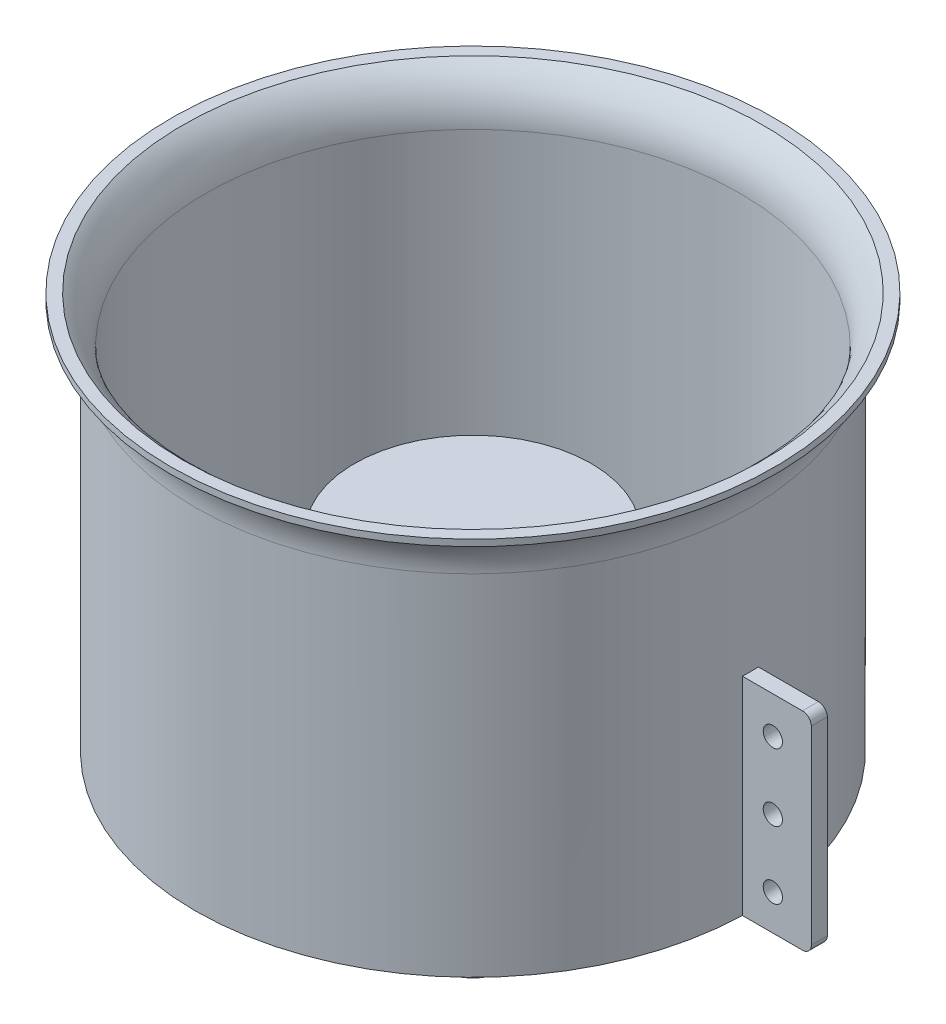
ISO-10303-21;
HEADER;
FILE_DESCRIPTION(('STEP AP214'),'2;1');
FILE_NAME('part.step','',(''),(''),'','','');
FILE_SCHEMA(('AUTOMOTIVE_DESIGN { 1 0 10303 214 1 1 1 1 }'));
ENDSEC;
DATA;
#1=APPLICATION_CONTEXT('core data for automotive mechanical design processes');
#2=APPLICATION_PROTOCOL_DEFINITION('international standard','automotive_design',2000,#1);
#3=PRODUCT_CONTEXT('',#1,'mechanical');
#4=PRODUCT('Part','Part','',(#3));
#5=PRODUCT_RELATED_PRODUCT_CATEGORY('part','',(#4));
#6=PRODUCT_DEFINITION_FORMATION('','',#4);
#7=PRODUCT_DEFINITION_CONTEXT('part definition',#1,'design');
#8=PRODUCT_DEFINITION('design','',#6,#7);
#9=PRODUCT_DEFINITION_SHAPE('','',#8);
#10=(LENGTH_UNIT() NAMED_UNIT(*) SI_UNIT(.MILLI.,.METRE.));
#11=(NAMED_UNIT(*) PLANE_ANGLE_UNIT() SI_UNIT($,.RADIAN.));
#12=(NAMED_UNIT(*) SI_UNIT($,.STERADIAN.) SOLID_ANGLE_UNIT());
#13=UNCERTAINTY_MEASURE_WITH_UNIT(LENGTH_MEASURE(1.E-05),#10,'distance_accuracy_value','');
#14=(GEOMETRIC_REPRESENTATION_CONTEXT(3) GLOBAL_UNCERTAINTY_ASSIGNED_CONTEXT((#13)) GLOBAL_UNIT_ASSIGNED_CONTEXT((#10,
#11,#12)) REPRESENTATION_CONTEXT('',''));
#15=CARTESIAN_POINT('',(0.,0.,0.));
#16=DIRECTION('',(0.,0.,1.));
#17=DIRECTION('',(1.,0.,0.));
#18=AXIS2_PLACEMENT_3D('',#15,#16,#17);
#19=CARTESIAN_POINT('',(0.,-20.,0.));
#20=DIRECTION('',(0.,-1.,0.));
#21=DIRECTION('',(0.,0.,-1.));
#22=AXIS2_PLACEMENT_3D('',#19,#20,#21);
#23=PLANE('',#22);
#24=CARTESIAN_POINT('',(0.,-20.,0.));
#25=DIRECTION('',(0.,-1.,0.));
#26=DIRECTION('',(0.,0.,-1.));
#27=AXIS2_PLACEMENT_3D('',#24,#25,#26);
#28=CIRCLE('',#27,17.5);
#29=CARTESIAN_POINT('',(0.,-20.,-17.5));
#30=VERTEX_POINT('',#29);
#31=EDGE_CURVE('E51',#30,#30,#28,.T.);
#32=ORIENTED_EDGE('',*,*,#31,.T.);
#33=EDGE_LOOP('',(#32));
#34=FACE_BOUND('',#33,.T.);
#35=CARTESIAN_POINT('',(0.,-20.,0.));
#36=DIRECTION('',(0.,-1.,0.));
#37=DIRECTION('',(0.,0.,-1.));
#38=AXIS2_PLACEMENT_3D('',#35,#36,#37);
#39=CIRCLE('',#38,6.);
#40=CARTESIAN_POINT('',(0.,-20.,-6.));
#41=VERTEX_POINT('',#40);
#42=EDGE_CURVE('E59',#41,#41,#39,.T.);
#43=ORIENTED_EDGE('',*,*,#42,.F.);
#44=EDGE_LOOP('',(#43));
#45=FACE_BOUND('',#44,.T.);
#46=ADVANCED_FACE('F40',(#34,#45),#23,.T.);
#47=CARTESIAN_POINT('',(0.,0.,0.));
#48=DIRECTION('',(0.,-1.,0.));
#49=DIRECTION('',(0.,0.,-1.));
#50=AXIS2_PLACEMENT_3D('',#47,#48,#49);
#51=PLANE('',#50);
#52=CARTESIAN_POINT('',(0.,0.,0.));
#53=DIRECTION('',(0.,-1.,0.));
#54=DIRECTION('',(0.,0.,-1.));
#55=AXIS2_PLACEMENT_3D('',#52,#53,#54);
#56=CIRCLE('',#55,20.);
#57=CARTESIAN_POINT('',(0.,0.,-20.));
#58=VERTEX_POINT('',#57);
#59=EDGE_CURVE('E44',#58,#58,#56,.T.);
#60=ORIENTED_EDGE('',*,*,#59,.T.);
#61=EDGE_LOOP('',(#60));
#62=FACE_BOUND('',#61,.T.);
#63=CARTESIAN_POINT('',(0.,0.,0.));
#64=DIRECTION('',(0.,-1.,0.));
#65=DIRECTION('',(0.,0.,-1.));
#66=AXIS2_PLACEMENT_3D('',#63,#64,#65);
#67=CIRCLE('',#66,17.5);
#68=CARTESIAN_POINT('',(0.,0.,-17.5));
#69=VERTEX_POINT('',#68);
#70=EDGE_CURVE('E53',#69,#69,#67,.T.);
#71=ORIENTED_EDGE('',*,*,#70,.F.);
#72=EDGE_LOOP('',(#71));
#73=FACE_BOUND('',#72,.T.);
#74=ADVANCED_FACE('F75',(#62,#73),#51,.T.);
#75=CARTESIAN_POINT('',(0.,32.,0.));
#76=DIRECTION('',(0.,-1.,0.));
#77=DIRECTION('',(0.,0.,-1.));
#78=AXIS2_PLACEMENT_3D('',#75,#76,#77);
#79=CYLINDRICAL_SURFACE('',#78,20.);
#80=CARTESIAN_POINT('',(0.,32.,0.));
#81=DIRECTION('',(0.,-1.,0.));
#82=DIRECTION('',(0.,0.,-1.));
#83=AXIS2_PLACEMENT_3D('',#80,#81,#82);
#84=CIRCLE('',#83,20.);
#85=CARTESIAN_POINT('',(0.,32.,-20.));
#86=VERTEX_POINT('',#85);
#87=EDGE_CURVE('E11',#86,#86,#84,.T.);
#88=ORIENTED_EDGE('',*,*,#87,.T.);
#89=EDGE_LOOP('',(#88));
#90=FACE_BOUND('',#89,.T.);
#91=ORIENTED_EDGE('',*,*,#59,.F.);
#92=EDGE_LOOP('',(#91));
#93=FACE_BOUND('',#92,.T.);
#94=ADVANCED_FACE('F42',(#90,#93),#79,.T.);
#95=CARTESIAN_POINT('',(0.,32.,0.));
#96=DIRECTION('',(0.,-1.,0.));
#97=DIRECTION('',(0.,0.,-1.));
#98=AXIS2_PLACEMENT_3D('',#95,#96,#97);
#99=PLANE('',#98);
#100=ORIENTED_EDGE('',*,*,#87,.F.);
#101=EDGE_LOOP('',(#100));
#102=FACE_BOUND('',#101,.T.);
#103=ADVANCED_FACE('F86',(#102),#99,.F.);
#104=CARTESIAN_POINT('',(0.,-20.,0.));
#105=DIRECTION('',(0.,1.,0.));
#106=DIRECTION('',(0.,0.,1.));
#107=AXIS2_PLACEMENT_3D('',#104,#105,#106);
#108=CYLINDRICAL_SURFACE('',#107,17.5);
#109=ORIENTED_EDGE('',*,*,#31,.F.);
#110=EDGE_LOOP('',(#109));
#111=FACE_BOUND('',#110,.T.);
#112=ORIENTED_EDGE('',*,*,#70,.T.);
#113=EDGE_LOOP('',(#112));
#114=FACE_BOUND('',#113,.T.);
#115=ADVANCED_FACE('F70',(#111,#114),#108,.T.);
#116=CARTESIAN_POINT('',(0.,-29.,0.));
#117=DIRECTION('',(0.,1.,0.));
#118=DIRECTION('',(0.,0.,1.));
#119=AXIS2_PLACEMENT_3D('',#116,#117,#118);
#120=CYLINDRICAL_SURFACE('',#119,6.);
#121=CARTESIAN_POINT('',(0.,-29.,0.));
#122=DIRECTION('',(0.,-1.,0.));
#123=DIRECTION('',(0.,0.,-1.));
#124=AXIS2_PLACEMENT_3D('',#121,#122,#123);
#125=CIRCLE('',#124,6.);
#126=CARTESIAN_POINT('',(0.,-29.,-6.));
#127=VERTEX_POINT('',#126);
#128=EDGE_CURVE('E56',#127,#127,#125,.T.);
#129=ORIENTED_EDGE('',*,*,#128,.F.);
#130=EDGE_LOOP('',(#129));
#131=FACE_BOUND('',#130,.T.);
#132=ORIENTED_EDGE('',*,*,#42,.T.);
#133=EDGE_LOOP('',(#132));
#134=FACE_BOUND('',#133,.T.);
#135=ADVANCED_FACE('F67',(#131,#134),#120,.T.);
#136=CARTESIAN_POINT('',(0.,-29.,0.));
#137=DIRECTION('',(0.,-1.,0.));
#138=DIRECTION('',(0.,0.,-1.));
#139=AXIS2_PLACEMENT_3D('',#136,#137,#138);
#140=PLANE('',#139);
#141=ORIENTED_EDGE('',*,*,#128,.T.);
#142=EDGE_LOOP('',(#141));
#143=FACE_BOUND('',#142,.T.);
#144=ADVANCED_FACE('F65',(#143),#140,.T.);
#145=CLOSED_SHELL('',(#46,#74,#94,#103,#115,#135,#144));
#146=MANIFOLD_SOLID_BREP('B2',#145);
#147=CARTESIAN_POINT('',(-46.875,0.,0.));
#148=DIRECTION('',(0.,-1.,0.));
#149=DIRECTION('',(0.,0.,-1.));
#150=AXIS2_PLACEMENT_3D('',#147,#148,#149);
#151=PLANE('',#150);
#152=CARTESIAN_POINT('',(0.,0.,0.));
#153=DIRECTION('',(0.,1.,0.));
#154=DIRECTION('',(0.,0.,1.));
#155=AXIS2_PLACEMENT_3D('',#152,#153,#154);
#156=CIRCLE('',#155,45.075);
#157=CARTESIAN_POINT('',(0.,0.,45.075));
#158=VERTEX_POINT('',#157);
#159=EDGE_CURVE('E346',#158,#158,#156,.T.);
#160=ORIENTED_EDGE('',*,*,#159,.T.);
#161=EDGE_LOOP('',(#160));
#162=FACE_BOUND('',#161,.T.);
#163=DIRECTION('',(-1.,0.,0.));
#164=VECTOR('',#163,1.);
#165=CARTESIAN_POINT('',(45.075,0.,-1.35));
#166=LINE('',#165,#164);
#167=CARTESIAN_POINT('',(57.,0.,-1.35));
#168=VERTEX_POINT('',#167);
#169=CARTESIAN_POINT('',(46.855555967249,0.,-1.35));
#170=VERTEX_POINT('',#169);
#171=EDGE_CURVE('E233',#168,#170,#166,.T.);
#172=ORIENTED_EDGE('',*,*,#171,.F.);
#173=DIRECTION('',(0.,0.,-1.));
#174=VECTOR('',#173,1.);
#175=CARTESIAN_POINT('',(57.,0.,0.));
#176=LINE('',#175,#174);
#177=CARTESIAN_POINT('',(57.,0.,1.35));
#178=VERTEX_POINT('',#177);
#179=EDGE_CURVE('E38',#168,#178,#176,.F.);
#180=ORIENTED_EDGE('',*,*,#179,.T.);
#181=DIRECTION('',(-1.,0.,0.));
#182=VECTOR('',#181,1.);
#183=CARTESIAN_POINT('',(45.075,0.,1.35));
#184=LINE('',#183,#182);
#185=CARTESIAN_POINT('',(46.855555967249,0.,1.35));
#186=VERTEX_POINT('',#185);
#187=EDGE_CURVE('E288',#178,#186,#184,.T.);
#188=ORIENTED_EDGE('',*,*,#187,.T.);
#189=CARTESIAN_POINT('',(0.,0.,0.));
#190=DIRECTION('',(0.,1.,0.));
#191=DIRECTION('',(0.,0.,1.));
#192=AXIS2_PLACEMENT_3D('',#189,#190,#191);
#193=CIRCLE('',#192,46.875);
#194=CARTESIAN_POINT('',(-46.855555967249,0.,1.35));
#195=VERTEX_POINT('',#194);
#196=EDGE_CURVE('E326',#195,#186,#193,.T.);
#197=ORIENTED_EDGE('',*,*,#196,.F.);
#198=DIRECTION('',(1.,0.,0.));
#199=VECTOR('',#198,1.);
#200=CARTESIAN_POINT('',(-45.075,0.,1.35));
#201=LINE('',#200,#199);
#202=CARTESIAN_POINT('',(-57.,0.,1.35));
#203=VERTEX_POINT('',#202);
#204=EDGE_CURVE('E314',#203,#195,#201,.T.);
#205=ORIENTED_EDGE('',*,*,#204,.F.);
#206=DIRECTION('',(0.,0.,1.));
#207=VECTOR('',#206,1.);
#208=CARTESIAN_POINT('',(-57.,0.,0.));
#209=LINE('',#208,#207);
#210=CARTESIAN_POINT('',(-57.,0.,-1.35));
#211=VERTEX_POINT('',#210);
#212=EDGE_CURVE('E238',#203,#211,#209,.F.);
#213=ORIENTED_EDGE('',*,*,#212,.T.);
#214=DIRECTION('',(1.,0.,0.));
#215=VECTOR('',#214,1.);
#216=CARTESIAN_POINT('',(-45.075,0.,-1.35));
#217=LINE('',#216,#215);
#218=CARTESIAN_POINT('',(-46.855555967249,0.,-1.35));
#219=VERTEX_POINT('',#218);
#220=EDGE_CURVE('E322',#211,#219,#217,.T.);
#221=ORIENTED_EDGE('',*,*,#220,.T.);
#222=EDGE_CURVE('E325',#170,#219,#193,.T.);
#223=ORIENTED_EDGE('',*,*,#222,.F.);
#224=EDGE_LOOP('',(#172,#180,#188,#197,#205,#213,#221,#223));
#225=FACE_BOUND('',#224,.T.);
#226=ADVANCED_FACE('F140',(#162,#225),#151,.T.);
#227=CARTESIAN_POINT('',(0.,55.,0.));
#228=DIRECTION('',(0.,1.,0.));
#229=DIRECTION('',(0.,0.,1.));
#230=AXIS2_PLACEMENT_3D('',#227,#228,#229);
#231=CYLINDRICAL_SURFACE('',#230,45.075);
#232=CARTESIAN_POINT('',(0.,59.,0.));
#233=DIRECTION('',(0.,1.,0.));
#234=DIRECTION('',(0.,0.,1.));
#235=AXIS2_PLACEMENT_3D('',#232,#233,#234);
#236=CIRCLE('',#235,45.075);
#237=CARTESIAN_POINT('',(0.,59.,45.075));
#238=VERTEX_POINT('',#237);
#239=EDGE_CURVE('E343',#238,#238,#236,.T.);
#240=ORIENTED_EDGE('',*,*,#239,.T.);
#241=EDGE_LOOP('',(#240));
#242=FACE_BOUND('',#241,.T.);
#243=ORIENTED_EDGE('',*,*,#159,.F.);
#244=EDGE_LOOP('',(#243));
#245=FACE_BOUND('',#244,.T.);
#246=ADVANCED_FACE('F406',(#242,#245),#231,.F.);
#247=CARTESIAN_POINT('',(0.,59.,0.));
#248=DIRECTION('',(0.,1.,0.));
#249=DIRECTION('',(0.,0.,1.));
#250=AXIS2_PLACEMENT_3D('',#247,#248,#249);
#251=TOROIDAL_SURFACE('',#250,55.1903662420382,10.1153662420382);
#252=CARTESIAN_POINT('',(0.,67.,0.));
#253=DIRECTION('',(0.,1.,0.));
#254=DIRECTION('',(0.,0.,1.));
#255=AXIS2_PLACEMENT_3D('',#252,#253,#254);
#256=CIRCLE('',#255,49.);
#257=CARTESIAN_POINT('',(0.,67.,49.));
#258=VERTEX_POINT('',#257);
#259=EDGE_CURVE('E340',#258,#258,#256,.T.);
#260=ORIENTED_EDGE('',*,*,#259,.T.);
#261=EDGE_LOOP('',(#260));
#262=FACE_BOUND('',#261,.T.);
#263=ORIENTED_EDGE('',*,*,#239,.F.);
#264=EDGE_LOOP('',(#263));
#265=FACE_BOUND('',#264,.T.);
#266=ADVANCED_FACE('F412',(#262,#265),#251,.T.);
#267=CARTESIAN_POINT('',(-49.,67.,0.));
#268=DIRECTION('',(0.,1.,0.));
#269=DIRECTION('',(0.,0.,1.));
#270=AXIS2_PLACEMENT_3D('',#267,#268,#269);
#271=PLANE('',#270);
#272=CARTESIAN_POINT('',(0.,67.,0.));
#273=DIRECTION('',(0.,1.,0.));
#274=DIRECTION('',(0.,0.,1.));
#275=AXIS2_PLACEMENT_3D('',#272,#273,#274);
#276=CIRCLE('',#275,51.);
#277=CARTESIAN_POINT('',(0.,67.,51.));
#278=VERTEX_POINT('',#277);
#279=EDGE_CURVE('E337',#278,#278,#276,.T.);
#280=ORIENTED_EDGE('',*,*,#279,.T.);
#281=EDGE_LOOP('',(#280));
#282=FACE_BOUND('',#281,.T.);
#283=ORIENTED_EDGE('',*,*,#259,.F.);
#284=EDGE_LOOP('',(#283));
#285=FACE_BOUND('',#284,.T.);
#286=ADVANCED_FACE('F466',(#282,#285),#271,.T.);
#287=CARTESIAN_POINT('',(0.,55.,0.));
#288=DIRECTION('',(0.,1.,0.));
#289=DIRECTION('',(0.,0.,1.));
#290=AXIS2_PLACEMENT_3D('',#287,#288,#289);
#291=CYLINDRICAL_SURFACE('',#290,51.);
#292=CARTESIAN_POINT('',(0.,65.9,0.));
#293=DIRECTION('',(0.,1.,0.));
#294=DIRECTION('',(0.,0.,1.));
#295=AXIS2_PLACEMENT_3D('',#292,#293,#294);
#296=CIRCLE('',#295,51.);
#297=CARTESIAN_POINT('',(0.,65.9,51.));
#298=VERTEX_POINT('',#297);
#299=EDGE_CURVE('E334',#298,#298,#296,.T.);
#300=ORIENTED_EDGE('',*,*,#299,.T.);
#301=EDGE_LOOP('',(#300));
#302=FACE_BOUND('',#301,.T.);
#303=ORIENTED_EDGE('',*,*,#279,.F.);
#304=EDGE_LOOP('',(#303));
#305=FACE_BOUND('',#304,.T.);
#306=ADVANCED_FACE('F462',(#302,#305),#291,.T.);
#307=CARTESIAN_POINT('',(-51.,65.9,0.));
#308=DIRECTION('',(0.,-1.,0.));
#309=DIRECTION('',(0.,0.,-1.));
#310=AXIS2_PLACEMENT_3D('',#307,#308,#309);
#311=PLANE('',#310);
#312=CARTESIAN_POINT('',(0.,65.9,0.));
#313=DIRECTION('',(0.,1.,0.));
#314=DIRECTION('',(0.,0.,1.));
#315=AXIS2_PLACEMENT_3D('',#312,#313,#314);
#316=CIRCLE('',#315,49.5);
#317=CARTESIAN_POINT('',(0.,65.9,49.5));
#318=VERTEX_POINT('',#317);
#319=EDGE_CURVE('E331',#318,#318,#316,.T.);
#320=ORIENTED_EDGE('',*,*,#319,.T.);
#321=EDGE_LOOP('',(#320));
#322=FACE_BOUND('',#321,.T.);
#323=ORIENTED_EDGE('',*,*,#299,.F.);
#324=EDGE_LOOP('',(#323));
#325=FACE_BOUND('',#324,.T.);
#326=ADVANCED_FACE('F458',(#322,#325),#311,.T.);
#327=CARTESIAN_POINT('',(0.,59.,0.));
#328=DIRECTION('',(0.,1.,0.));
#329=DIRECTION('',(0.,0.,1.));
#330=AXIS2_PLACEMENT_3D('',#327,#328,#329);
#331=TOROIDAL_SURFACE('',#330,57.2560714285714,10.3810714285714);
#332=CARTESIAN_POINT('',(0.,59.,0.));
#333=DIRECTION('',(0.,1.,0.));
#334=DIRECTION('',(0.,0.,1.));
#335=AXIS2_PLACEMENT_3D('',#332,#333,#334);
#336=CIRCLE('',#335,46.875);
#337=CARTESIAN_POINT('',(0.,59.,46.875));
#338=VERTEX_POINT('',#337);
#339=EDGE_CURVE('E328',#338,#338,#336,.T.);
#340=ORIENTED_EDGE('',*,*,#339,.T.);
#341=EDGE_LOOP('',(#340));
#342=FACE_BOUND('',#341,.T.);
#343=ORIENTED_EDGE('',*,*,#319,.F.);
#344=EDGE_LOOP('',(#343));
#345=FACE_BOUND('',#344,.T.);
#346=ADVANCED_FACE('F455',(#342,#345),#331,.F.);
#347=CARTESIAN_POINT('',(0.,55.,0.));
#348=DIRECTION('',(0.,1.,0.));
#349=DIRECTION('',(0.,0.,1.));
#350=AXIS2_PLACEMENT_3D('',#347,#348,#349);
#351=CYLINDRICAL_SURFACE('',#350,46.875);
#352=DIRECTION('',(0.,1.,0.));
#353=VECTOR('',#352,1.);
#354=CARTESIAN_POINT('',(46.855555967249,55.,1.35));
#355=LINE('',#354,#353);
#356=CARTESIAN_POINT('',(46.855555967249,35.,1.35));
#357=VERTEX_POINT('',#356);
#358=EDGE_CURVE('E255',#357,#186,#355,.F.);
#359=ORIENTED_EDGE('',*,*,#358,.F.);
#360=CARTESIAN_POINT('',(0.,35.,0.));
#361=DIRECTION('',(0.,1.,0.));
#362=DIRECTION('',(0.,0.,1.));
#363=AXIS2_PLACEMENT_3D('',#360,#361,#362);
#364=CIRCLE('',#363,46.875);
#365=CARTESIAN_POINT('',(46.855555967249,35.,-1.35));
#366=VERTEX_POINT('',#365);
#367=EDGE_CURVE('E237',#366,#357,#364,.F.);
#368=ORIENTED_EDGE('',*,*,#367,.F.);
#369=DIRECTION('',(0.,1.,0.));
#370=VECTOR('',#369,1.);
#371=CARTESIAN_POINT('',(46.855555967249,55.,-1.35));
#372=LINE('',#371,#370);
#373=EDGE_CURVE('E229',#366,#170,#372,.F.);
#374=ORIENTED_EDGE('',*,*,#373,.T.);
#375=ORIENTED_EDGE('',*,*,#222,.T.);
#376=DIRECTION('',(0.,1.,0.));
#377=VECTOR('',#376,1.);
#378=CARTESIAN_POINT('',(-46.855555967249,55.,-1.35));
#379=LINE('',#378,#377);
#380=CARTESIAN_POINT('',(-46.855555967249,35.,-1.35));
#381=VERTEX_POINT('',#380);
#382=EDGE_CURVE('E354',#381,#219,#379,.F.);
#383=ORIENTED_EDGE('',*,*,#382,.F.);
#384=CARTESIAN_POINT('',(0.,35.,0.));
#385=DIRECTION('',(0.,1.,0.));
#386=DIRECTION('',(0.,0.,1.));
#387=AXIS2_PLACEMENT_3D('',#384,#385,#386);
#388=CIRCLE('',#387,46.875);
#389=CARTESIAN_POINT('',(-46.855555967249,35.,1.35));
#390=VERTEX_POINT('',#389);
#391=EDGE_CURVE('E352',#390,#381,#388,.F.);
#392=ORIENTED_EDGE('',*,*,#391,.F.);
#393=DIRECTION('',(0.,1.,0.));
#394=VECTOR('',#393,1.);
#395=CARTESIAN_POINT('',(-46.855555967249,55.,1.35));
#396=LINE('',#395,#394);
#397=EDGE_CURVE('E349',#390,#195,#396,.F.);
#398=ORIENTED_EDGE('',*,*,#397,.T.);
#399=ORIENTED_EDGE('',*,*,#196,.T.);
#400=EDGE_LOOP('',(#359,#368,#374,#375,#383,#392,#398,#399));
#401=FACE_BOUND('',#400,.T.);
#402=ORIENTED_EDGE('',*,*,#339,.F.);
#403=EDGE_LOOP('',(#402));
#404=FACE_BOUND('',#403,.T.);
#405=ADVANCED_FACE('F251',(#401,#404),#351,.T.);
#406=CARTESIAN_POINT('',(-58.5,35.,-1.35));
#407=DIRECTION('',(-1.,0.,0.));
#408=DIRECTION('',(0.,-1.,0.));
#409=AXIS2_PLACEMENT_3D('',#406,#407,#408);
#410=PLANE('',#409);
#411=DIRECTION('',(0.,-1.,0.));
#412=VECTOR('',#411,1.);
#413=CARTESIAN_POINT('',(-58.5,35.,1.35));
#414=LINE('',#413,#412);
#415=CARTESIAN_POINT('',(-58.5,33.5,1.35));
#416=VERTEX_POINT('',#415);
#417=CARTESIAN_POINT('',(-58.5,1.5,1.35));
#418=VERTEX_POINT('',#417);
#419=EDGE_CURVE('E311',#416,#418,#414,.T.);
#420=ORIENTED_EDGE('',*,*,#419,.F.);
#421=DIRECTION('',(0.,0.,1.));
#422=VECTOR('',#421,1.);
#423=CARTESIAN_POINT('',(-58.5,33.5,-1.35));
#424=LINE('',#423,#422);
#425=CARTESIAN_POINT('',(-58.5,33.5,-1.35));
#426=VERTEX_POINT('',#425);
#427=EDGE_CURVE('E367',#416,#426,#424,.F.);
#428=ORIENTED_EDGE('',*,*,#427,.T.);
#429=DIRECTION('',(0.,-1.,0.));
#430=VECTOR('',#429,1.);
#431=CARTESIAN_POINT('',(-58.5,35.,-1.35));
#432=LINE('',#431,#430);
#433=CARTESIAN_POINT('',(-58.5,1.5,-1.35));
#434=VERTEX_POINT('',#433);
#435=EDGE_CURVE('E319',#426,#434,#432,.T.);
#436=ORIENTED_EDGE('',*,*,#435,.T.);
#437=DIRECTION('',(0.,0.,1.));
#438=VECTOR('',#437,1.);
#439=CARTESIAN_POINT('',(-58.5,1.5,-1.35));
#440=LINE('',#439,#438);
#441=EDGE_CURVE('E364',#434,#418,#440,.T.);
#442=ORIENTED_EDGE('',*,*,#441,.T.);
#443=EDGE_LOOP('',(#420,#428,#436,#442));
#444=FACE_BOUND('',#443,.T.);
#445=ADVANCED_FACE('F387',(#444),#410,.T.);
#446=CARTESIAN_POINT('',(-45.075,35.,-1.35));
#447=DIRECTION('',(0.,1.,0.));
#448=DIRECTION('',(0.,0.,1.));
#449=AXIS2_PLACEMENT_3D('',#446,#447,#448);
#450=PLANE('',#449);
#451=DIRECTION('',(-1.,0.,0.));
#452=VECTOR('',#451,1.);
#453=CARTESIAN_POINT('',(-45.075,35.,-1.35));
#454=LINE('',#453,#452);
#455=CARTESIAN_POINT('',(-57.,35.,-1.35));
#456=VERTEX_POINT('',#455);
#457=EDGE_CURVE('E316',#381,#456,#454,.T.);
#458=ORIENTED_EDGE('',*,*,#457,.T.);
#459=DIRECTION('',(0.,0.,1.));
#460=VECTOR('',#459,1.);
#461=CARTESIAN_POINT('',(-57.,35.,-1.35));
#462=LINE('',#461,#460);
#463=CARTESIAN_POINT('',(-57.,35.,1.35));
#464=VERTEX_POINT('',#463);
#465=EDGE_CURVE('E357',#456,#464,#462,.T.);
#466=ORIENTED_EDGE('',*,*,#465,.T.);
#467=DIRECTION('',(-1.,0.,0.));
#468=VECTOR('',#467,1.);
#469=CARTESIAN_POINT('',(-45.075,35.,1.35));
#470=LINE('',#469,#468);
#471=EDGE_CURVE('E308',#390,#464,#470,.T.);
#472=ORIENTED_EDGE('',*,*,#471,.F.);
#473=ORIENTED_EDGE('',*,*,#391,.T.);
#474=EDGE_LOOP('',(#458,#466,#472,#473));
#475=FACE_BOUND('',#474,.T.);
#476=ADVANCED_FACE('F397',(#475),#450,.T.);
#477=CARTESIAN_POINT('',(0.,0.,-1.35));
#478=DIRECTION('',(0.,0.,-1.));
#479=DIRECTION('',(-1.,0.,0.));
#480=AXIS2_PLACEMENT_3D('',#477,#478,#479);
#481=PLANE('',#480);
#482=CARTESIAN_POINT('',(-52.,28.75,-1.35));
#483=DIRECTION('',(0.,0.,-1.));
#484=DIRECTION('',(-1.,0.,0.));
#485=AXIS2_PLACEMENT_3D('',#482,#483,#484);
#486=CIRCLE('',#485,1.625);
#487=CARTESIAN_POINT('',(-53.625,28.75,-1.35));
#488=VERTEX_POINT('',#487);
#489=EDGE_CURVE('E293',#488,#488,#486,.T.);
#490=ORIENTED_EDGE('',*,*,#489,.F.);
#491=EDGE_LOOP('',(#490));
#492=FACE_BOUND('',#491,.T.);
#493=CARTESIAN_POINT('',(-52.,17.375,-1.35));
#494=DIRECTION('',(0.,0.,-1.));
#495=DIRECTION('',(-1.,0.,0.));
#496=AXIS2_PLACEMENT_3D('',#493,#494,#495);
#497=CIRCLE('',#496,1.625);
#498=CARTESIAN_POINT('',(-53.625,17.375,-1.35));
#499=VERTEX_POINT('',#498);
#500=EDGE_CURVE('E299',#499,#499,#497,.T.);
#501=ORIENTED_EDGE('',*,*,#500,.F.);
#502=EDGE_LOOP('',(#501));
#503=FACE_BOUND('',#502,.T.);
#504=CARTESIAN_POINT('',(-52.,6.,-1.35));
#505=DIRECTION('',(0.,0.,-1.));
#506=DIRECTION('',(-1.,0.,0.));
#507=AXIS2_PLACEMENT_3D('',#504,#505,#506);
#508=CIRCLE('',#507,1.625);
#509=CARTESIAN_POINT('',(-53.625,6.,-1.35));
#510=VERTEX_POINT('',#509);
#511=EDGE_CURVE('E305',#510,#510,#508,.T.);
#512=ORIENTED_EDGE('',*,*,#511,.F.);
#513=EDGE_LOOP('',(#512));
#514=FACE_BOUND('',#513,.T.);
#515=ORIENTED_EDGE('',*,*,#435,.F.);
#516=CARTESIAN_POINT('',(-57.,33.5,-1.35));
#517=DIRECTION('',(0.,0.,-1.));
#518=DIRECTION('',(-1.,0.,0.));
#519=AXIS2_PLACEMENT_3D('',#516,#517,#518);
#520=CIRCLE('',#519,1.5);
#521=EDGE_CURVE('E371',#426,#456,#520,.T.);
#522=ORIENTED_EDGE('',*,*,#521,.T.);
#523=ORIENTED_EDGE('',*,*,#457,.F.);
#524=ORIENTED_EDGE('',*,*,#382,.T.);
#525=ORIENTED_EDGE('',*,*,#220,.F.);
#526=CARTESIAN_POINT('',(-57.,1.5,-1.35));
#527=DIRECTION('',(0.,0.,-1.));
#528=DIRECTION('',(-1.,0.,0.));
#529=AXIS2_PLACEMENT_3D('',#526,#527,#528);
#530=CIRCLE('',#529,1.5);
#531=EDGE_CURVE('E369',#211,#434,#530,.T.);
#532=ORIENTED_EDGE('',*,*,#531,.T.);
#533=EDGE_LOOP('',(#515,#522,#523,#524,#525,#532));
#534=FACE_BOUND('',#533,.T.);
#535=ADVANCED_FACE('F380',(#492,#503,#514,#534),#481,.T.);
#536=CARTESIAN_POINT('',(0.,0.,1.35));
#537=DIRECTION('',(0.,0.,-1.));
#538=DIRECTION('',(-1.,0.,0.));
#539=AXIS2_PLACEMENT_3D('',#536,#537,#538);
#540=PLANE('',#539);
#541=CARTESIAN_POINT('',(-52.,28.75,1.35));
#542=DIRECTION('',(0.,0.,1.));
#543=DIRECTION('',(1.,0.,0.));
#544=AXIS2_PLACEMENT_3D('',#541,#542,#543);
#545=CIRCLE('',#544,1.625);
#546=CARTESIAN_POINT('',(-50.375,28.75,1.35));
#547=VERTEX_POINT('',#546);
#548=EDGE_CURVE('E290',#547,#547,#545,.T.);
#549=ORIENTED_EDGE('',*,*,#548,.F.);
#550=EDGE_LOOP('',(#549));
#551=FACE_BOUND('',#550,.T.);
#552=CARTESIAN_POINT('',(-52.,17.375,1.35));
#553=DIRECTION('',(0.,0.,1.));
#554=DIRECTION('',(1.,0.,0.));
#555=AXIS2_PLACEMENT_3D('',#552,#553,#554);
#556=CIRCLE('',#555,1.625);
#557=CARTESIAN_POINT('',(-50.375,17.375,1.35));
#558=VERTEX_POINT('',#557);
#559=EDGE_CURVE('E296',#558,#558,#556,.T.);
#560=ORIENTED_EDGE('',*,*,#559,.F.);
#561=EDGE_LOOP('',(#560));
#562=FACE_BOUND('',#561,.T.);
#563=CARTESIAN_POINT('',(-52.,6.,1.35));
#564=DIRECTION('',(0.,0.,1.));
#565=DIRECTION('',(1.,0.,0.));
#566=AXIS2_PLACEMENT_3D('',#563,#564,#565);
#567=CIRCLE('',#566,1.625);
#568=CARTESIAN_POINT('',(-50.375,6.,1.35));
#569=VERTEX_POINT('',#568);
#570=EDGE_CURVE('E302',#569,#569,#567,.T.);
#571=ORIENTED_EDGE('',*,*,#570,.F.);
#572=EDGE_LOOP('',(#571));
#573=FACE_BOUND('',#572,.T.);
#574=ORIENTED_EDGE('',*,*,#471,.T.);
#575=CARTESIAN_POINT('',(-57.,33.5,1.35));
#576=DIRECTION('',(0.,0.,-1.));
#577=DIRECTION('',(-1.,0.,0.));
#578=AXIS2_PLACEMENT_3D('',#575,#576,#577);
#579=CIRCLE('',#578,1.5);
#580=EDGE_CURVE('E362',#464,#416,#579,.F.);
#581=ORIENTED_EDGE('',*,*,#580,.T.);
#582=ORIENTED_EDGE('',*,*,#419,.T.);
#583=CARTESIAN_POINT('',(-57.,1.5,1.35));
#584=DIRECTION('',(0.,0.,-1.));
#585=DIRECTION('',(-1.,0.,0.));
#586=AXIS2_PLACEMENT_3D('',#583,#584,#585);
#587=CIRCLE('',#586,1.5);
#588=EDGE_CURVE('E360',#418,#203,#587,.F.);
#589=ORIENTED_EDGE('',*,*,#588,.T.);
#590=ORIENTED_EDGE('',*,*,#204,.T.);
#591=ORIENTED_EDGE('',*,*,#397,.F.);
#592=EDGE_LOOP('',(#574,#581,#582,#589,#590,#591));
#593=FACE_BOUND('',#592,.T.);
#594=ADVANCED_FACE('F390',(#551,#562,#573,#593),#540,.F.);
#595=CARTESIAN_POINT('',(-52.,6.,-51.));
#596=DIRECTION('',(0.,0.,1.));
#597=DIRECTION('',(1.,0.,0.));
#598=AXIS2_PLACEMENT_3D('',#595,#596,#597);
#599=CYLINDRICAL_SURFACE('',#598,1.625);
#600=ORIENTED_EDGE('',*,*,#511,.T.);
#601=EDGE_LOOP('',(#600));
#602=FACE_BOUND('',#601,.T.);
#603=ORIENTED_EDGE('',*,*,#570,.T.);
#604=EDGE_LOOP('',(#603));
#605=FACE_BOUND('',#604,.T.);
#606=ADVANCED_FACE('F438',(#602,#605),#599,.F.);
#607=CARTESIAN_POINT('',(-52.,17.375,-51.));
#608=DIRECTION('',(0.,0.,1.));
#609=DIRECTION('',(1.,0.,0.));
#610=AXIS2_PLACEMENT_3D('',#607,#608,#609);
#611=CYLINDRICAL_SURFACE('',#610,1.625);
#612=ORIENTED_EDGE('',*,*,#500,.T.);
#613=EDGE_LOOP('',(#612));
#614=FACE_BOUND('',#613,.T.);
#615=ORIENTED_EDGE('',*,*,#559,.T.);
#616=EDGE_LOOP('',(#615));
#617=FACE_BOUND('',#616,.T.);
#618=ADVANCED_FACE('F434',(#614,#617),#611,.F.);
#619=CARTESIAN_POINT('',(-52.,28.75,-51.));
#620=DIRECTION('',(0.,0.,1.));
#621=DIRECTION('',(1.,0.,0.));
#622=AXIS2_PLACEMENT_3D('',#619,#620,#621);
#623=CYLINDRICAL_SURFACE('',#622,1.625);
#624=ORIENTED_EDGE('',*,*,#489,.T.);
#625=EDGE_LOOP('',(#624));
#626=FACE_BOUND('',#625,.T.);
#627=ORIENTED_EDGE('',*,*,#548,.T.);
#628=EDGE_LOOP('',(#627));
#629=FACE_BOUND('',#628,.T.);
#630=ADVANCED_FACE('F419',(#626,#629),#623,.F.);
#631=CARTESIAN_POINT('',(-57.,33.5,-1.35));
#632=DIRECTION('',(0.,0.,1.));
#633=DIRECTION('',(1.,0.,0.));
#634=AXIS2_PLACEMENT_3D('',#631,#632,#633);
#635=CYLINDRICAL_SURFACE('',#634,1.5);
#636=ORIENTED_EDGE('',*,*,#521,.F.);
#637=ORIENTED_EDGE('',*,*,#427,.F.);
#638=ORIENTED_EDGE('',*,*,#580,.F.);
#639=ORIENTED_EDGE('',*,*,#465,.F.);
#640=EDGE_LOOP('',(#636,#637,#638,#639));
#641=FACE_BOUND('',#640,.T.);
#642=ADVANCED_FACE('F395',(#641),#635,.T.);
#643=CARTESIAN_POINT('',(-57.,1.5,-1.35));
#644=DIRECTION('',(0.,0.,1.));
#645=DIRECTION('',(1.,0.,0.));
#646=AXIS2_PLACEMENT_3D('',#643,#644,#645);
#647=CYLINDRICAL_SURFACE('',#646,1.5);
#648=ORIENTED_EDGE('',*,*,#531,.F.);
#649=ORIENTED_EDGE('',*,*,#212,.F.);
#650=ORIENTED_EDGE('',*,*,#588,.F.);
#651=ORIENTED_EDGE('',*,*,#441,.F.);
#652=EDGE_LOOP('',(#648,#649,#650,#651));
#653=FACE_BOUND('',#652,.T.);
#654=ADVANCED_FACE('F384',(#653),#647,.T.);
#655=CARTESIAN_POINT('',(58.5,35.,1.35));
#656=DIRECTION('',(1.,0.,0.));
#657=DIRECTION('',(0.,1.,0.));
#658=AXIS2_PLACEMENT_3D('',#655,#656,#657);
#659=PLANE('',#658);
#660=DIRECTION('',(0.,-1.,0.));
#661=VECTOR('',#660,1.);
#662=CARTESIAN_POINT('',(58.5,35.,-1.35));
#663=LINE('',#662,#661);
#664=CARTESIAN_POINT('',(58.5,33.5,-1.35));
#665=VERTEX_POINT('',#664);
#666=CARTESIAN_POINT('',(58.5,1.5,-1.35));
#667=VERTEX_POINT('',#666);
#668=EDGE_CURVE('E247',#665,#667,#663,.T.);
#669=ORIENTED_EDGE('',*,*,#668,.F.);
#670=DIRECTION('',(0.,0.,-1.));
#671=VECTOR('',#670,1.);
#672=CARTESIAN_POINT('',(58.5,33.5,1.35));
#673=LINE('',#672,#671);
#674=CARTESIAN_POINT('',(58.5,33.5,1.35));
#675=VERTEX_POINT('',#674);
#676=EDGE_CURVE('E268',#665,#675,#673,.F.);
#677=ORIENTED_EDGE('',*,*,#676,.T.);
#678=DIRECTION('',(0.,-1.,0.));
#679=VECTOR('',#678,1.);
#680=CARTESIAN_POINT('',(58.5,35.,1.35));
#681=LINE('',#680,#679);
#682=CARTESIAN_POINT('',(58.5,1.5,1.35));
#683=VERTEX_POINT('',#682);
#684=EDGE_CURVE('E273',#675,#683,#681,.T.);
#685=ORIENTED_EDGE('',*,*,#684,.T.);
#686=DIRECTION('',(0.,0.,-1.));
#687=VECTOR('',#686,1.);
#688=CARTESIAN_POINT('',(58.5,1.5,1.35));
#689=LINE('',#688,#687);
#690=EDGE_CURVE('E265',#683,#667,#689,.T.);
#691=ORIENTED_EDGE('',*,*,#690,.T.);
#692=EDGE_LOOP('',(#669,#677,#685,#691));
#693=FACE_BOUND('',#692,.T.);
#694=ADVANCED_FACE('F281',(#693),#659,.T.);
#695=CARTESIAN_POINT('',(45.075,35.,1.35));
#696=DIRECTION('',(0.,1.,0.));
#697=DIRECTION('',(0.,0.,1.));
#698=AXIS2_PLACEMENT_3D('',#695,#696,#697);
#699=PLANE('',#698);
#700=DIRECTION('',(1.,0.,0.));
#701=VECTOR('',#700,1.);
#702=CARTESIAN_POINT('',(45.075,35.,1.35));
#703=LINE('',#702,#701);
#704=CARTESIAN_POINT('',(57.,35.,1.35));
#705=VERTEX_POINT('',#704);
#706=EDGE_CURVE('E272',#357,#705,#703,.T.);
#707=ORIENTED_EDGE('',*,*,#706,.T.);
#708=DIRECTION('',(0.,0.,-1.));
#709=VECTOR('',#708,1.);
#710=CARTESIAN_POINT('',(57.,35.,1.35));
#711=LINE('',#710,#709);
#712=CARTESIAN_POINT('',(57.,35.,-1.35));
#713=VERTEX_POINT('',#712);
#714=EDGE_CURVE('E246',#705,#713,#711,.T.);
#715=ORIENTED_EDGE('',*,*,#714,.T.);
#716=DIRECTION('',(1.,0.,0.));
#717=VECTOR('',#716,1.);
#718=CARTESIAN_POINT('',(45.075,35.,-1.35));
#719=LINE('',#718,#717);
#720=EDGE_CURVE('E232',#366,#713,#719,.T.);
#721=ORIENTED_EDGE('',*,*,#720,.F.);
#722=ORIENTED_EDGE('',*,*,#367,.T.);
#723=EDGE_LOOP('',(#707,#715,#721,#722));
#724=FACE_BOUND('',#723,.T.);
#725=ADVANCED_FACE('F243',(#724),#699,.T.);
#726=CARTESIAN_POINT('',(0.,0.,1.35));
#727=DIRECTION('',(0.,0.,1.));
#728=DIRECTION('',(1.,0.,0.));
#729=AXIS2_PLACEMENT_3D('',#726,#727,#728);
#730=PLANE('',#729);
#731=CARTESIAN_POINT('',(52.,28.75,1.35));
#732=DIRECTION('',(0.,0.,1.));
#733=DIRECTION('',(1.,0.,0.));
#734=AXIS2_PLACEMENT_3D('',#731,#732,#733);
#735=CIRCLE('',#734,1.625);
#736=CARTESIAN_POINT('',(53.625,28.75,1.35));
#737=VERTEX_POINT('',#736);
#738=EDGE_CURVE('E650',#737,#737,#735,.T.);
#739=ORIENTED_EDGE('',*,*,#738,.F.);
#740=EDGE_LOOP('',(#739));
#741=FACE_BOUND('',#740,.T.);
#742=CARTESIAN_POINT('',(52.,17.375,1.35));
#743=DIRECTION('',(0.,0.,1.));
#744=DIRECTION('',(1.,0.,0.));
#745=AXIS2_PLACEMENT_3D('',#742,#743,#744);
#746=CIRCLE('',#745,1.625);
#747=CARTESIAN_POINT('',(53.625,17.375,1.35));
#748=VERTEX_POINT('',#747);
#749=EDGE_CURVE('E660',#748,#748,#746,.T.);
#750=ORIENTED_EDGE('',*,*,#749,.F.);
#751=EDGE_LOOP('',(#750));
#752=FACE_BOUND('',#751,.T.);
#753=CARTESIAN_POINT('',(52.,6.,1.35));
#754=DIRECTION('',(0.,0.,1.));
#755=DIRECTION('',(1.,0.,0.));
#756=AXIS2_PLACEMENT_3D('',#753,#754,#755);
#757=CIRCLE('',#756,1.625);
#758=CARTESIAN_POINT('',(53.625,6.,1.35));
#759=VERTEX_POINT('',#758);
#760=EDGE_CURVE('E248',#759,#759,#757,.T.);
#761=ORIENTED_EDGE('',*,*,#760,.F.);
#762=EDGE_LOOP('',(#761));
#763=FACE_BOUND('',#762,.T.);
#764=ORIENTED_EDGE('',*,*,#684,.F.);
#765=CARTESIAN_POINT('',(57.,33.5,1.35));
#766=DIRECTION('',(0.,0.,1.));
#767=DIRECTION('',(1.,0.,0.));
#768=AXIS2_PLACEMENT_3D('',#765,#766,#767);
#769=CIRCLE('',#768,1.5);
#770=EDGE_CURVE('E148',#675,#705,#769,.T.);
#771=ORIENTED_EDGE('',*,*,#770,.T.);
#772=ORIENTED_EDGE('',*,*,#706,.F.);
#773=ORIENTED_EDGE('',*,*,#358,.T.);
#774=ORIENTED_EDGE('',*,*,#187,.F.);
#775=CARTESIAN_POINT('',(57.,1.5,1.35));
#776=DIRECTION('',(0.,0.,1.));
#777=DIRECTION('',(1.,0.,0.));
#778=AXIS2_PLACEMENT_3D('',#775,#776,#777);
#779=CIRCLE('',#778,1.5);
#780=EDGE_CURVE('E160',#178,#683,#779,.T.);
#781=ORIENTED_EDGE('',*,*,#780,.T.);
#782=EDGE_LOOP('',(#764,#771,#772,#773,#774,#781));
#783=FACE_BOUND('',#782,.T.);
#784=ADVANCED_FACE('F271',(#741,#752,#763,#783),#730,.T.);
#785=CARTESIAN_POINT('',(0.,0.,-1.35));
#786=DIRECTION('',(0.,0.,1.));
#787=DIRECTION('',(1.,0.,0.));
#788=AXIS2_PLACEMENT_3D('',#785,#786,#787);
#789=PLANE('',#788);
#790=CARTESIAN_POINT('',(52.,28.75,-1.35));
#791=DIRECTION('',(0.,0.,-1.));
#792=DIRECTION('',(-1.,0.,0.));
#793=AXIS2_PLACEMENT_3D('',#790,#791,#792);
#794=CIRCLE('',#793,1.625);
#795=CARTESIAN_POINT('',(50.375,28.75,-1.35));
#796=VERTEX_POINT('',#795);
#797=EDGE_CURVE('E653',#796,#796,#794,.T.);
#798=ORIENTED_EDGE('',*,*,#797,.F.);
#799=EDGE_LOOP('',(#798));
#800=FACE_BOUND('',#799,.T.);
#801=CARTESIAN_POINT('',(52.,17.375,-1.35));
#802=DIRECTION('',(0.,0.,-1.));
#803=DIRECTION('',(-1.,0.,0.));
#804=AXIS2_PLACEMENT_3D('',#801,#802,#803);
#805=CIRCLE('',#804,1.625);
#806=CARTESIAN_POINT('',(50.375,17.375,-1.35));
#807=VERTEX_POINT('',#806);
#808=EDGE_CURVE('E655',#807,#807,#805,.T.);
#809=ORIENTED_EDGE('',*,*,#808,.F.);
#810=EDGE_LOOP('',(#809));
#811=FACE_BOUND('',#810,.T.);
#812=CARTESIAN_POINT('',(52.,6.,-1.35));
#813=DIRECTION('',(0.,0.,-1.));
#814=DIRECTION('',(-1.,0.,0.));
#815=AXIS2_PLACEMENT_3D('',#812,#813,#814);
#816=CIRCLE('',#815,1.625);
#817=CARTESIAN_POINT('',(50.375,6.,-1.35));
#818=VERTEX_POINT('',#817);
#819=EDGE_CURVE('E663',#818,#818,#816,.T.);
#820=ORIENTED_EDGE('',*,*,#819,.F.);
#821=EDGE_LOOP('',(#820));
#822=FACE_BOUND('',#821,.T.);
#823=ORIENTED_EDGE('',*,*,#720,.T.);
#824=CARTESIAN_POINT('',(57.,33.5,-1.35));
#825=DIRECTION('',(0.,0.,1.));
#826=DIRECTION('',(1.,0.,0.));
#827=AXIS2_PLACEMENT_3D('',#824,#825,#826);
#828=CIRCLE('',#827,1.5);
#829=EDGE_CURVE('E263',#713,#665,#828,.F.);
#830=ORIENTED_EDGE('',*,*,#829,.T.);
#831=ORIENTED_EDGE('',*,*,#668,.T.);
#832=CARTESIAN_POINT('',(57.,1.5,-1.35));
#833=DIRECTION('',(0.,0.,1.));
#834=DIRECTION('',(1.,0.,0.));
#835=AXIS2_PLACEMENT_3D('',#832,#833,#834);
#836=CIRCLE('',#835,1.5);
#837=EDGE_CURVE('E261',#667,#168,#836,.F.);
#838=ORIENTED_EDGE('',*,*,#837,.T.);
#839=ORIENTED_EDGE('',*,*,#171,.T.);
#840=ORIENTED_EDGE('',*,*,#373,.F.);
#841=EDGE_LOOP('',(#823,#830,#831,#838,#839,#840));
#842=FACE_BOUND('',#841,.T.);
#843=ADVANCED_FACE('F231',(#800,#811,#822,#842),#789,.F.);
#844=CARTESIAN_POINT('',(52.,6.,51.));
#845=DIRECTION('',(0.,0.,-1.));
#846=DIRECTION('',(-1.,0.,0.));
#847=AXIS2_PLACEMENT_3D('',#844,#845,#846);
#848=CYLINDRICAL_SURFACE('',#847,1.625);
#849=ORIENTED_EDGE('',*,*,#760,.T.);
#850=EDGE_LOOP('',(#849));
#851=FACE_BOUND('',#850,.T.);
#852=ORIENTED_EDGE('',*,*,#819,.T.);
#853=EDGE_LOOP('',(#852));
#854=FACE_BOUND('',#853,.T.);
#855=ADVANCED_FACE('F604',(#851,#854),#848,.F.);
#856=CARTESIAN_POINT('',(52.,17.375,51.));
#857=DIRECTION('',(0.,0.,-1.));
#858=DIRECTION('',(-1.,0.,0.));
#859=AXIS2_PLACEMENT_3D('',#856,#857,#858);
#860=CYLINDRICAL_SURFACE('',#859,1.625);
#861=ORIENTED_EDGE('',*,*,#749,.T.);
#862=EDGE_LOOP('',(#861));
#863=FACE_BOUND('',#862,.T.);
#864=ORIENTED_EDGE('',*,*,#808,.T.);
#865=EDGE_LOOP('',(#864));
#866=FACE_BOUND('',#865,.T.);
#867=ADVANCED_FACE('F612',(#863,#866),#860,.F.);
#868=CARTESIAN_POINT('',(52.,28.75,51.));
#869=DIRECTION('',(0.,0.,-1.));
#870=DIRECTION('',(-1.,0.,0.));
#871=AXIS2_PLACEMENT_3D('',#868,#869,#870);
#872=CYLINDRICAL_SURFACE('',#871,1.625);
#873=ORIENTED_EDGE('',*,*,#738,.T.);
#874=EDGE_LOOP('',(#873));
#875=FACE_BOUND('',#874,.T.);
#876=ORIENTED_EDGE('',*,*,#797,.T.);
#877=EDGE_LOOP('',(#876));
#878=FACE_BOUND('',#877,.T.);
#879=ADVANCED_FACE('F404',(#875,#878),#872,.F.);
#880=CARTESIAN_POINT('',(57.,33.5,1.35));
#881=DIRECTION('',(0.,0.,-1.));
#882=DIRECTION('',(-1.,0.,0.));
#883=AXIS2_PLACEMENT_3D('',#880,#881,#882);
#884=CYLINDRICAL_SURFACE('',#883,1.5);
#885=ORIENTED_EDGE('',*,*,#770,.F.);
#886=ORIENTED_EDGE('',*,*,#676,.F.);
#887=ORIENTED_EDGE('',*,*,#829,.F.);
#888=ORIENTED_EDGE('',*,*,#714,.F.);
#889=EDGE_LOOP('',(#885,#886,#887,#888));
#890=FACE_BOUND('',#889,.T.);
#891=ADVANCED_FACE('F277',(#890),#884,.T.);
#892=CARTESIAN_POINT('',(57.,1.5,1.35));
#893=DIRECTION('',(0.,0.,-1.));
#894=DIRECTION('',(-1.,0.,0.));
#895=AXIS2_PLACEMENT_3D('',#892,#893,#894);
#896=CYLINDRICAL_SURFACE('',#895,1.5);
#897=ORIENTED_EDGE('',*,*,#780,.F.);
#898=ORIENTED_EDGE('',*,*,#179,.F.);
#899=ORIENTED_EDGE('',*,*,#837,.F.);
#900=ORIENTED_EDGE('',*,*,#690,.F.);
#901=EDGE_LOOP('',(#897,#898,#899,#900));
#902=FACE_BOUND('',#901,.T.);
#903=ADVANCED_FACE('F142',(#902),#896,.T.);
#904=CLOSED_SHELL('',(#226,#246,#266,#286,#306,#326,#346,#405,#445,#476,#535,#594,#606,#618,
#630,#642,#654,#694,#725,#784,#843,#855,#867,#879,#891,#903));
#905=MANIFOLD_SOLID_BREP('B6',#904);
#906=ADVANCED_BREP_SHAPE_REPRESENTATION('',(#18,#146,#905),#14);
#907=SHAPE_DEFINITION_REPRESENTATION(#9,#906);
ENDSEC;
END-ISO-10303-21;
